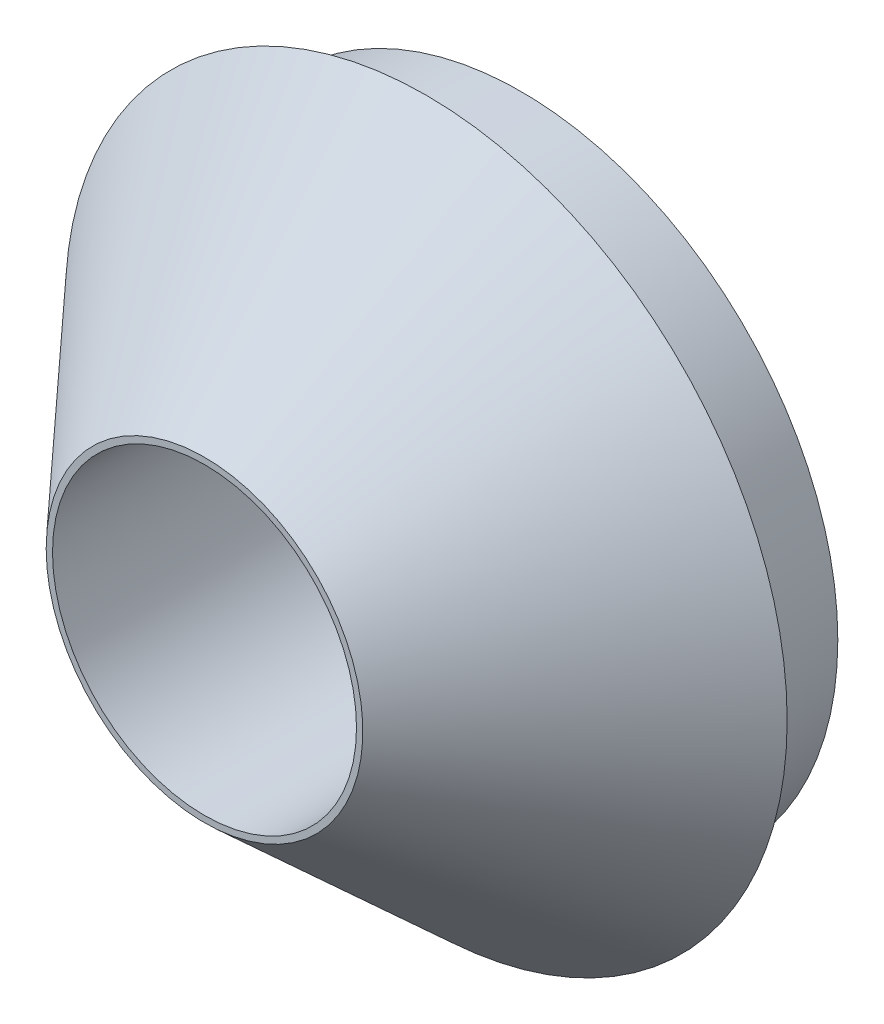
ISO-10303-21;
HEADER;
FILE_DESCRIPTION(('STEP AP214'),'2;1');
FILE_NAME('part.step','',(''),(''),'','','');
FILE_SCHEMA(('AUTOMOTIVE_DESIGN { 1 0 10303 214 1 1 1 1 }'));
ENDSEC;
DATA;
#1=APPLICATION_CONTEXT('core data for automotive mechanical design processes');
#2=APPLICATION_PROTOCOL_DEFINITION('international standard','automotive_design',2000,#1);
#3=PRODUCT_CONTEXT('',#1,'mechanical');
#4=PRODUCT('Part','Part','',(#3));
#5=PRODUCT_RELATED_PRODUCT_CATEGORY('part','',(#4));
#6=PRODUCT_DEFINITION_FORMATION('','',#4);
#7=PRODUCT_DEFINITION_CONTEXT('part definition',#1,'design');
#8=PRODUCT_DEFINITION('design','',#6,#7);
#9=PRODUCT_DEFINITION_SHAPE('','',#8);
#10=(LENGTH_UNIT() NAMED_UNIT(*) SI_UNIT(.MILLI.,.METRE.));
#11=(NAMED_UNIT(*) PLANE_ANGLE_UNIT() SI_UNIT($,.RADIAN.));
#12=(NAMED_UNIT(*) SI_UNIT($,.STERADIAN.) SOLID_ANGLE_UNIT());
#13=UNCERTAINTY_MEASURE_WITH_UNIT(LENGTH_MEASURE(1.E-05),#10,'distance_accuracy_value','');
#14=(GEOMETRIC_REPRESENTATION_CONTEXT(3) GLOBAL_UNCERTAINTY_ASSIGNED_CONTEXT((#13)) GLOBAL_UNIT_ASSIGNED_CONTEXT((#10,
#11,#12)) REPRESENTATION_CONTEXT('',''));
#15=CARTESIAN_POINT('',(0.,0.,0.));
#16=DIRECTION('',(0.,0.,1.));
#17=DIRECTION('',(1.,0.,0.));
#18=AXIS2_PLACEMENT_3D('',#15,#16,#17);
#19=CARTESIAN_POINT('',(0.,0.,0.));
#20=DIRECTION('',(0.,0.,-1.));
#21=DIRECTION('',(-1.,0.,0.));
#22=AXIS2_PLACEMENT_3D('',#19,#20,#21);
#23=PLANE('',#22);
#24=CARTESIAN_POINT('',(0.,0.,0.));
#25=DIRECTION('',(0.,0.,-1.));
#26=DIRECTION('',(-1.,0.,0.));
#27=AXIS2_PLACEMENT_3D('',#24,#25,#26);
#28=CIRCLE('',#27,6.096);
#29=CARTESIAN_POINT('',(-6.096,0.,0.));
#30=VERTEX_POINT('',#29);
#31=EDGE_CURVE('E60',#30,#30,#28,.T.);
#32=ORIENTED_EDGE('',*,*,#31,.T.);
#33=EDGE_LOOP('',(#32));
#34=FACE_BOUND('',#33,.T.);
#35=CARTESIAN_POINT('',(0.,0.,0.));
#36=DIRECTION('',(0.,0.,-1.));
#37=DIRECTION('',(-1.,0.,0.));
#38=AXIS2_PLACEMENT_3D('',#35,#36,#37);
#39=CIRCLE('',#38,6.35);
#40=CARTESIAN_POINT('',(-6.35,0.,0.));
#41=VERTEX_POINT('',#40);
#42=EDGE_CURVE('E10',#41,#41,#39,.T.);
#43=ORIENTED_EDGE('',*,*,#42,.F.);
#44=EDGE_LOOP('',(#43));
#45=FACE_BOUND('',#44,.T.);
#46=ADVANCED_FACE('F37',(#34,#45),#23,.F.);
#47=CARTESIAN_POINT('',(0.,0.,0.));
#48=DIRECTION('',(0.,0.,-1.));
#49=DIRECTION('',(-1.,0.,0.));
#50=AXIS2_PLACEMENT_3D('',#47,#48,#49);
#51=CONICAL_SURFACE('',#50,6.35,0.740651931942833);
#52=CARTESIAN_POINT('',(0.,0.,-8.89));
#53=DIRECTION('',(0.,0.,-1.));
#54=DIRECTION('',(-1.,0.,0.));
#55=AXIS2_PLACEMENT_3D('',#52,#53,#54);
#56=CIRCLE('',#55,14.478);
#57=CARTESIAN_POINT('',(-14.478,0.,-8.89));
#58=VERTEX_POINT('',#57);
#59=EDGE_CURVE('E44',#58,#58,#56,.T.);
#60=ORIENTED_EDGE('',*,*,#59,.F.);
#61=EDGE_LOOP('',(#60));
#62=FACE_BOUND('',#61,.T.);
#63=ORIENTED_EDGE('',*,*,#42,.T.);
#64=EDGE_LOOP('',(#63));
#65=FACE_BOUND('',#64,.T.);
#66=ADVANCED_FACE('F91',(#62,#65),#51,.T.);
#67=CARTESIAN_POINT('',(14.478,0.,-8.89));
#68=DIRECTION('',(0.,0.,1.));
#69=DIRECTION('',(1.,0.,0.));
#70=AXIS2_PLACEMENT_3D('',#67,#68,#69);
#71=PLANE('',#70);
#72=CARTESIAN_POINT('',(0.,0.,-8.89));
#73=DIRECTION('',(0.,0.,-1.));
#74=DIRECTION('',(-1.,0.,0.));
#75=AXIS2_PLACEMENT_3D('',#72,#73,#74);
#76=CIRCLE('',#75,12.7);
#77=CARTESIAN_POINT('',(-12.7,0.,-8.89));
#78=VERTEX_POINT('',#77);
#79=EDGE_CURVE('E49',#78,#78,#76,.T.);
#80=ORIENTED_EDGE('',*,*,#79,.F.);
#81=EDGE_LOOP('',(#80));
#82=FACE_BOUND('',#81,.T.);
#83=ORIENTED_EDGE('',*,*,#59,.T.);
#84=EDGE_LOOP('',(#83));
#85=FACE_BOUND('',#84,.T.);
#86=ADVANCED_FACE('F86',(#82,#85),#71,.F.);
#87=CARTESIAN_POINT('',(0.,0.,-12.7));
#88=DIRECTION('',(0.,0.,-1.));
#89=DIRECTION('',(-1.,0.,0.));
#90=AXIS2_PLACEMENT_3D('',#87,#88,#89);
#91=CYLINDRICAL_SURFACE('',#90,12.7);
#92=CARTESIAN_POINT('',(0.,0.,-12.7));
#93=DIRECTION('',(0.,0.,-1.));
#94=DIRECTION('',(-1.,0.,0.));
#95=AXIS2_PLACEMENT_3D('',#92,#93,#94);
#96=CIRCLE('',#95,12.7);
#97=CARTESIAN_POINT('',(-12.7,0.,-12.7));
#98=VERTEX_POINT('',#97);
#99=EDGE_CURVE('E54',#98,#98,#96,.T.);
#100=ORIENTED_EDGE('',*,*,#99,.F.);
#101=EDGE_LOOP('',(#100));
#102=FACE_BOUND('',#101,.T.);
#103=ORIENTED_EDGE('',*,*,#79,.T.);
#104=EDGE_LOOP('',(#103));
#105=FACE_BOUND('',#104,.T.);
#106=ADVANCED_FACE('F80',(#102,#105),#91,.T.);
#107=CARTESIAN_POINT('',(12.7,0.,-12.7));
#108=DIRECTION('',(0.,0.,1.));
#109=DIRECTION('',(1.,0.,0.));
#110=AXIS2_PLACEMENT_3D('',#107,#108,#109);
#111=PLANE('',#110);
#112=CARTESIAN_POINT('',(0.,0.,-12.7));
#113=DIRECTION('',(0.,0.,-1.));
#114=DIRECTION('',(-1.,0.,0.));
#115=AXIS2_PLACEMENT_3D('',#112,#113,#114);
#116=CIRCLE('',#115,6.096);
#117=CARTESIAN_POINT('',(-6.096,0.,-12.7));
#118=VERTEX_POINT('',#117);
#119=EDGE_CURVE('E61',#118,#118,#116,.T.);
#120=ORIENTED_EDGE('',*,*,#119,.F.);
#121=EDGE_LOOP('',(#120));
#122=FACE_BOUND('',#121,.T.);
#123=ORIENTED_EDGE('',*,*,#99,.T.);
#124=EDGE_LOOP('',(#123));
#125=FACE_BOUND('',#124,.T.);
#126=ADVANCED_FACE('F74',(#122,#125),#111,.F.);
#127=CARTESIAN_POINT('',(0.,0.,0.));
#128=DIRECTION('',(0.,0.,-1.));
#129=DIRECTION('',(-1.,0.,0.));
#130=AXIS2_PLACEMENT_3D('',#127,#128,#129);
#131=CYLINDRICAL_SURFACE('',#130,6.096);
#132=ORIENTED_EDGE('',*,*,#31,.F.);
#133=EDGE_LOOP('',(#132));
#134=FACE_BOUND('',#133,.T.);
#135=ORIENTED_EDGE('',*,*,#119,.T.);
#136=EDGE_LOOP('',(#135));
#137=FACE_BOUND('',#136,.T.);
#138=ADVANCED_FACE('F71',(#134,#137),#131,.F.);
#139=CLOSED_SHELL('',(#46,#66,#86,#106,#126,#138));
#140=MANIFOLD_SOLID_BREP('B2',#139);
#141=ADVANCED_BREP_SHAPE_REPRESENTATION('',(#18,#140),#14);
#142=SHAPE_DEFINITION_REPRESENTATION(#9,#141);
ENDSEC;
END-ISO-10303-21;
